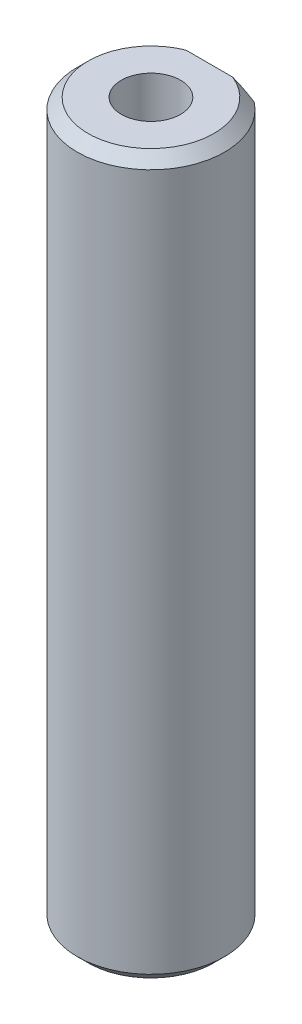
ISO-10303-21;
HEADER;
FILE_DESCRIPTION(('STEP AP214'),'2;1');
FILE_NAME('part.step','',(''),(''),'','','');
FILE_SCHEMA(('AUTOMOTIVE_DESIGN { 1 0 10303 214 1 1 1 1 }'));
ENDSEC;
DATA;
#1=APPLICATION_CONTEXT('core data for automotive mechanical design processes');
#2=APPLICATION_PROTOCOL_DEFINITION('international standard','automotive_design',2000,#1);
#3=PRODUCT_CONTEXT('',#1,'mechanical');
#4=PRODUCT('Part','Part','',(#3));
#5=PRODUCT_RELATED_PRODUCT_CATEGORY('part','',(#4));
#6=PRODUCT_DEFINITION_FORMATION('','',#4);
#7=PRODUCT_DEFINITION_CONTEXT('part definition',#1,'design');
#8=PRODUCT_DEFINITION('design','',#6,#7);
#9=PRODUCT_DEFINITION_SHAPE('','',#8);
#10=(LENGTH_UNIT() NAMED_UNIT(*) SI_UNIT(.MILLI.,.METRE.));
#11=(NAMED_UNIT(*) PLANE_ANGLE_UNIT() SI_UNIT($,.RADIAN.));
#12=(NAMED_UNIT(*) SI_UNIT($,.STERADIAN.) SOLID_ANGLE_UNIT());
#13=UNCERTAINTY_MEASURE_WITH_UNIT(LENGTH_MEASURE(1.E-05),#10,'distance_accuracy_value','');
#14=(GEOMETRIC_REPRESENTATION_CONTEXT(3) GLOBAL_UNCERTAINTY_ASSIGNED_CONTEXT((#13)) GLOBAL_UNIT_ASSIGNED_CONTEXT((#10,
#11,#12)) REPRESENTATION_CONTEXT('',''));
#15=CARTESIAN_POINT('',(0.,0.,0.));
#16=DIRECTION('',(0.,0.,1.));
#17=DIRECTION('',(1.,0.,0.));
#18=AXIS2_PLACEMENT_3D('',#15,#16,#17);
#19=CARTESIAN_POINT('',(0.,40.,-3.24961536185438));
#20=DIRECTION('',(0.,0.,-1.));
#21=DIRECTION('',(-1.,0.,0.));
#22=AXIS2_PLACEMENT_3D('',#19,#20,#21);
#23=PLANE('',#22);
#24=CARTESIAN_POINT('',(0.,20.,-3.24961536185438));
#25=DIRECTION('',(0.,0.,-1.));
#26=DIRECTION('',(-1.,0.,0.));
#27=AXIS2_PLACEMENT_3D('',#24,#25,#26);
#28=CIRCLE('',#27,1.75);
#29=CARTESIAN_POINT('',(-1.75,20.,-3.24961536185438));
#30=VERTEX_POINT('',#29);
#31=EDGE_CURVE('E105',#30,#30,#28,.T.);
#32=ORIENTED_EDGE('',*,*,#31,.F.);
#33=EDGE_LOOP('',(#32));
#34=FACE_BOUND('',#33,.T.);
#35=DIRECTION('',(0.,-1.,0.));
#36=VECTOR('',#35,1.);
#37=CARTESIAN_POINT('',(2.5,40.,-3.24961536185438));
#38=LINE('',#37,#36);
#39=CARTESIAN_POINT('',(2.5,39.4,-3.24961536185438));
#40=VERTEX_POINT('',#39);
#41=CARTESIAN_POINT('',(2.5,0.600000000000003,-3.24961536185438));
#42=VERTEX_POINT('',#41);
#43=EDGE_CURVE('E115',#40,#42,#38,.T.);
#44=ORIENTED_EDGE('',*,*,#43,.T.);
#45=CARTESIAN_POINT('',(2.5,0.600000000000003,-3.24961536185438));
#46=CARTESIAN_POINT('',(2.40432093025178,0.541691126129059,-3.24961536185438));
#47=CARTESIAN_POINT('',(2.30770860355266,0.484853971053794,-3.24961536185438));
#48=CARTESIAN_POINT('',(2.11257458402426,0.37510173604733,-3.24961536185438));
#49=CARTESIAN_POINT('',(2.01405769013835,0.322178097655985,-3.24961536185438));
#50=CARTESIAN_POINT('',(1.81458529619335,0.220931812528962,-3.24961536185438));
#51=CARTESIAN_POINT('',(1.71362843265534,0.172611816538498,-3.24961536185438));
#52=CARTESIAN_POINT('',(1.5089130315046,0.0816816493494726,-3.24961536185438));
#53=CARTESIAN_POINT('',(1.40514866298078,0.0390846665122068,-3.24961536185438));
#54=CARTESIAN_POINT('',(1.29999999999999,0.,-3.24961536185438));
#55=B_SPLINE_CURVE_WITH_KNOTS('',3,(#45,#46,#47,#48,#49,#50,#51,#52,#53,#54),.UNSPECIFIED.,.F.,
.F.,(4,2,2,2,4),(0.,0.336170169463952,0.671581981819804,1.00718576933356,1.34355013617968),.UNSPECIFIED.);
#56=CARTESIAN_POINT('',(1.29999999999999,0.,-3.24961536185438));
#57=VERTEX_POINT('',#56);
#58=EDGE_CURVE('E50',#42,#57,#55,.T.);
#59=ORIENTED_EDGE('',*,*,#58,.T.);
#60=DIRECTION('',(1.,0.,0.));
#61=VECTOR('',#60,1.);
#62=CARTESIAN_POINT('',(0.,0.,-3.24961536185438));
#63=LINE('',#62,#61);
#64=CARTESIAN_POINT('',(-1.29999999999999,0.,-3.24961536185438));
#65=VERTEX_POINT('',#64);
#66=EDGE_CURVE('E109',#65,#57,#63,.T.);
#67=ORIENTED_EDGE('',*,*,#66,.F.);
#68=CARTESIAN_POINT('',(-1.29999999999999,0.,-3.24961536185438));
#69=CARTESIAN_POINT('',(-1.40514866298078,0.0390846665122067,-3.24961536185438));
#70=CARTESIAN_POINT('',(-1.5089130315046,0.0816816493494726,-3.24961536185438));
#71=CARTESIAN_POINT('',(-1.71362843265534,0.172611816538498,-3.24961536185438));
#72=CARTESIAN_POINT('',(-1.81458529619335,0.220931812528963,-3.24961536185438));
#73=CARTESIAN_POINT('',(-2.01405769013835,0.322178097655985,-3.24961536185438));
#74=CARTESIAN_POINT('',(-2.11257458402426,0.37510173604733,-3.24961536185438));
#75=CARTESIAN_POINT('',(-2.30770860355265,0.484853971053794,-3.24961536185438));
#76=CARTESIAN_POINT('',(-2.40432093025178,0.541691126129059,-3.24961536185438));
#77=CARTESIAN_POINT('',(-2.5,0.600000000000003,-3.24961536185438));
#78=B_SPLINE_CURVE_WITH_KNOTS('',3,(#68,#69,#70,#71,#72,#73,#74,#75,#76,#77),.UNSPECIFIED.,.F.,
.F.,(4,2,2,2,4),(0.,0.336364366846117,0.671968154359877,1.00737996671573,1.34355013617968),.UNSPECIFIED.);
#79=CARTESIAN_POINT('',(-2.5,0.600000000000003,-3.24961536185438));
#80=VERTEX_POINT('',#79);
#81=EDGE_CURVE('E171',#65,#80,#78,.T.);
#82=ORIENTED_EDGE('',*,*,#81,.T.);
#83=DIRECTION('',(0.,-1.,0.));
#84=VECTOR('',#83,1.);
#85=CARTESIAN_POINT('',(-2.5,40.,-3.24961536185438));
#86=LINE('',#85,#84);
#87=CARTESIAN_POINT('',(-2.5,39.4,-3.24961536185438));
#88=VERTEX_POINT('',#87);
#89=EDGE_CURVE('E118',#88,#80,#86,.T.);
#90=ORIENTED_EDGE('',*,*,#89,.F.);
#91=CARTESIAN_POINT('',(-2.5,39.4,-3.24961536185438));
#92=CARTESIAN_POINT('',(-2.40432093025178,39.4583088738709,-3.24961536185438));
#93=CARTESIAN_POINT('',(-2.30770860355265,39.5151460289462,-3.24961536185438));
#94=CARTESIAN_POINT('',(-2.11257458402426,39.6248982639527,-3.24961536185438));
#95=CARTESIAN_POINT('',(-2.01405769013834,39.677821902344,-3.24961536185438));
#96=CARTESIAN_POINT('',(-1.81458529619335,39.779068187471,-3.24961536185438));
#97=CARTESIAN_POINT('',(-1.71362843265533,39.8273881834615,-3.24961536185438));
#98=CARTESIAN_POINT('',(-1.50891303150459,39.9183183506505,-3.24961536185438));
#99=CARTESIAN_POINT('',(-1.40514866298077,39.9609153334878,-3.24961536185438));
#100=CARTESIAN_POINT('',(-1.29999999999998,40.,-3.24961536185438));
#101=B_SPLINE_CURVE_WITH_KNOTS('',3,(#91,#92,#93,#94,#95,#96,#97,#98,#99,#100),.UNSPECIFIED.,
.F.,.F.,(4,2,2,2,4),(0.,0.336170169463955,0.671581981819809,1.00718576933357,1.34355013617969),.UNSPECIFIED.);
#102=CARTESIAN_POINT('',(-1.29999999999998,40.,-3.24961536185438));
#103=VERTEX_POINT('',#102);
#104=EDGE_CURVE('E124',#88,#103,#101,.T.);
#105=ORIENTED_EDGE('',*,*,#104,.T.);
#106=DIRECTION('',(1.,0.,0.));
#107=VECTOR('',#106,1.);
#108=CARTESIAN_POINT('',(0.,40.,-3.24961536185438));
#109=LINE('',#108,#107);
#110=CARTESIAN_POINT('',(1.29999999999998,40.,-3.24961536185438));
#111=VERTEX_POINT('',#110);
#112=EDGE_CURVE('E112',#103,#111,#109,.T.);
#113=ORIENTED_EDGE('',*,*,#112,.T.);
#114=CARTESIAN_POINT('',(1.29999999999998,40.,-3.24961536185438));
#115=CARTESIAN_POINT('',(1.40514866298077,39.9609153334878,-3.24961536185438));
#116=CARTESIAN_POINT('',(1.50891303150459,39.9183183506505,-3.24961536185438));
#117=CARTESIAN_POINT('',(1.71362843265533,39.8273881834615,-3.24961536185438));
#118=CARTESIAN_POINT('',(1.81458529619335,39.779068187471,-3.24961536185438));
#119=CARTESIAN_POINT('',(2.01405769013835,39.677821902344,-3.24961536185438));
#120=CARTESIAN_POINT('',(2.11257458402426,39.6248982639527,-3.24961536185438));
#121=CARTESIAN_POINT('',(2.30770860355266,39.5151460289462,-3.24961536185438));
#122=CARTESIAN_POINT('',(2.40432093025178,39.4583088738709,-3.24961536185438));
#123=CARTESIAN_POINT('',(2.5,39.4,-3.24961536185438));
#124=B_SPLINE_CURVE_WITH_KNOTS('',3,(#114,#115,#116,#117,#118,#119,#120,#121,#122,#123),
.UNSPECIFIED.,.F.,.F.,(4,2,2,2,4),(0.,0.336364366846119,0.671968154359884,1.00737996671574,
1.34355013617969),.UNSPECIFIED.);
#125=EDGE_CURVE('E131',#111,#40,#124,.T.);
#126=ORIENTED_EDGE('',*,*,#125,.T.);
#127=EDGE_LOOP('',(#44,#59,#67,#82,#90,#105,#113,#126));
#128=FACE_BOUND('',#127,.T.);
#129=ADVANCED_FACE('F40',(#34,#128),#23,.T.);
#130=CARTESIAN_POINT('',(0.,40.,0.));
#131=DIRECTION('',(0.,-1.,0.));
#132=DIRECTION('',(0.,0.,-1.));
#133=AXIS2_PLACEMENT_3D('',#130,#131,#132);
#134=CYLINDRICAL_SURFACE('',#133,4.1);
#135=ORIENTED_EDGE('',*,*,#89,.T.);
#136=CARTESIAN_POINT('',(0.,0.600000000000003,0.));
#137=DIRECTION('',(0.,1.,0.));
#138=DIRECTION('',(0.,0.,1.));
#139=AXIS2_PLACEMENT_3D('',#136,#137,#138);
#140=CIRCLE('',#139,4.1);
#141=EDGE_CURVE('E169',#80,#42,#140,.T.);
#142=ORIENTED_EDGE('',*,*,#141,.T.);
#143=ORIENTED_EDGE('',*,*,#43,.F.);
#144=CARTESIAN_POINT('',(0.,39.4,0.));
#145=DIRECTION('',(0.,1.,0.));
#146=DIRECTION('',(0.,0.,1.));
#147=AXIS2_PLACEMENT_3D('',#144,#145,#146);
#148=CIRCLE('',#147,4.1);
#149=EDGE_CURVE('E166',#40,#88,#148,.F.);
#150=ORIENTED_EDGE('',*,*,#149,.T.);
#151=EDGE_LOOP('',(#135,#142,#143,#150));
#152=FACE_BOUND('',#151,.T.);
#153=ADVANCED_FACE('F155',(#152),#134,.T.);
#154=CARTESIAN_POINT('',(0.,40.,0.));
#155=DIRECTION('',(0.,1.,0.));
#156=DIRECTION('',(0.,0.,1.));
#157=AXIS2_PLACEMENT_3D('',#154,#155,#156);
#158=PLANE('',#157);
#159=CARTESIAN_POINT('',(0.,40.,0.));
#160=DIRECTION('',(0.,1.,0.));
#161=DIRECTION('',(0.,0.,1.));
#162=AXIS2_PLACEMENT_3D('',#159,#160,#161);
#163=CIRCLE('',#162,1.65);
#164=CARTESIAN_POINT('',(0.,40.,1.65));
#165=VERTEX_POINT('',#164);
#166=EDGE_CURVE('E94',#165,#165,#163,.T.);
#167=ORIENTED_EDGE('',*,*,#166,.F.);
#168=EDGE_LOOP('',(#167));
#169=FACE_BOUND('',#168,.T.);
#170=ORIENTED_EDGE('',*,*,#112,.F.);
#171=CARTESIAN_POINT('',(0.,40.,0.));
#172=DIRECTION('',(0.,1.,0.));
#173=DIRECTION('',(0.,0.,1.));
#174=AXIS2_PLACEMENT_3D('',#171,#172,#173);
#175=CIRCLE('',#174,3.49999999999999);
#176=EDGE_CURVE('E121',#103,#111,#175,.T.);
#177=ORIENTED_EDGE('',*,*,#176,.T.);
#178=EDGE_LOOP('',(#170,#177));
#179=FACE_BOUND('',#178,.T.);
#180=ADVANCED_FACE('F160',(#169,#179),#158,.T.);
#181=CARTESIAN_POINT('',(0.,0.,0.));
#182=DIRECTION('',(0.,1.,0.));
#183=DIRECTION('',(0.,0.,1.));
#184=AXIS2_PLACEMENT_3D('',#181,#182,#183);
#185=PLANE('',#184);
#186=CARTESIAN_POINT('',(0.,0.,0.));
#187=DIRECTION('',(0.,-1.,0.));
#188=DIRECTION('',(0.,0.,-1.));
#189=AXIS2_PLACEMENT_3D('',#186,#187,#188);
#190=CIRCLE('',#189,1.65);
#191=CARTESIAN_POINT('',(0.,0.,-1.65));
#192=VERTEX_POINT('',#191);
#193=EDGE_CURVE('E95',#192,#192,#190,.T.);
#194=ORIENTED_EDGE('',*,*,#193,.F.);
#195=EDGE_LOOP('',(#194));
#196=FACE_BOUND('',#195,.T.);
#197=ORIENTED_EDGE('',*,*,#66,.T.);
#198=CARTESIAN_POINT('',(0.,0.,0.));
#199=DIRECTION('',(0.,1.,0.));
#200=DIRECTION('',(0.,0.,1.));
#201=AXIS2_PLACEMENT_3D('',#198,#199,#200);
#202=CIRCLE('',#201,3.5);
#203=EDGE_CURVE('E11',#57,#65,#202,.F.);
#204=ORIENTED_EDGE('',*,*,#203,.T.);
#205=EDGE_LOOP('',(#197,#204));
#206=FACE_BOUND('',#205,.T.);
#207=ADVANCED_FACE('F183',(#196,#206),#185,.F.);
#208=CARTESIAN_POINT('',(0.,20.,0.750384638145617));
#209=DIRECTION('',(0.,0.,-1.));
#210=DIRECTION('',(-1.,0.,0.));
#211=AXIS2_PLACEMENT_3D('',#208,#209,#210);
#212=CYLINDRICAL_SURFACE('',#211,1.75);
#213=CARTESIAN_POINT('',(0.,20.,0.750384638145617));
#214=DIRECTION('',(0.,0.,-1.));
#215=DIRECTION('',(-1.,0.,0.));
#216=AXIS2_PLACEMENT_3D('',#213,#214,#215);
#217=CIRCLE('',#216,1.75);
#218=CARTESIAN_POINT('',(-1.75,20.,0.750384638145617));
#219=VERTEX_POINT('',#218);
#220=EDGE_CURVE('E106',#219,#219,#217,.T.);
#221=ORIENTED_EDGE('',*,*,#220,.F.);
#222=EDGE_LOOP('',(#221));
#223=FACE_BOUND('',#222,.T.);
#224=ORIENTED_EDGE('',*,*,#31,.T.);
#225=EDGE_LOOP('',(#224));
#226=FACE_BOUND('',#225,.T.);
#227=ADVANCED_FACE('F185',(#223,#226),#212,.F.);
#228=CARTESIAN_POINT('',(0.,20.,0.750384638145617));
#229=DIRECTION('',(0.,0.,-1.));
#230=DIRECTION('',(-1.,0.,0.));
#231=AXIS2_PLACEMENT_3D('',#228,#229,#230);
#232=PLANE('',#231);
#233=ORIENTED_EDGE('',*,*,#220,.T.);
#234=EDGE_LOOP('',(#233));
#235=FACE_BOUND('',#234,.T.);
#236=ADVANCED_FACE('F192',(#235),#232,.T.);
#237=CARTESIAN_POINT('',(0.,25.9914200213955,0.));
#238=DIRECTION('',(0.,1.,0.));
#239=DIRECTION('',(0.,0.,1.));
#240=AXIS2_PLACEMENT_3D('',#237,#238,#239);
#241=CONICAL_SURFACE('',#240,1.65,1.02974425867665);
#242=CARTESIAN_POINT('',(0.,25.,0.));
#243=VERTEX_POINT('',#242);
#244=VERTEX_LOOP('',#243);
#245=FACE_BOUND('',#244,.T.);
#246=CARTESIAN_POINT('',(0.,25.9914200213955,0.));
#247=DIRECTION('',(0.,1.,0.));
#248=DIRECTION('',(0.,0.,1.));
#249=AXIS2_PLACEMENT_3D('',#246,#247,#248);
#250=CIRCLE('',#249,1.65);
#251=CARTESIAN_POINT('',(0.,25.9914200213955,1.65));
#252=VERTEX_POINT('',#251);
#253=EDGE_CURVE('E98',#252,#252,#250,.T.);
#254=ORIENTED_EDGE('',*,*,#253,.T.);
#255=EDGE_LOOP('',(#254));
#256=FACE_BOUND('',#255,.T.);
#257=ADVANCED_FACE('F201',(#245,#256),#241,.F.);
#258=CARTESIAN_POINT('',(0.,40.,0.));
#259=DIRECTION('',(0.,1.,0.));
#260=DIRECTION('',(0.,0.,1.));
#261=AXIS2_PLACEMENT_3D('',#258,#259,#260);
#262=CYLINDRICAL_SURFACE('',#261,1.65);
#263=ORIENTED_EDGE('',*,*,#253,.F.);
#264=EDGE_LOOP('',(#263));
#265=FACE_BOUND('',#264,.T.);
#266=ORIENTED_EDGE('',*,*,#166,.T.);
#267=EDGE_LOOP('',(#266));
#268=FACE_BOUND('',#267,.T.);
#269=ADVANCED_FACE('F88',(#265,#268),#262,.F.);
#270=CARTESIAN_POINT('',(0.,14.0085799786045,0.));
#271=DIRECTION('',(0.,-1.,0.));
#272=DIRECTION('',(0.,0.,-1.));
#273=AXIS2_PLACEMENT_3D('',#270,#271,#272);
#274=CONICAL_SURFACE('',#273,1.65,1.02974425867665);
#275=CARTESIAN_POINT('',(0.,15.,0.));
#276=VERTEX_POINT('',#275);
#277=VERTEX_LOOP('',#276);
#278=FACE_BOUND('',#277,.T.);
#279=CARTESIAN_POINT('',(0.,14.0085799786045,0.));
#280=DIRECTION('',(0.,-1.,0.));
#281=DIRECTION('',(0.,0.,-1.));
#282=AXIS2_PLACEMENT_3D('',#279,#280,#281);
#283=CIRCLE('',#282,1.65);
#284=CARTESIAN_POINT('',(0.,14.0085799786045,-1.65));
#285=VERTEX_POINT('',#284);
#286=EDGE_CURVE('E92',#285,#285,#283,.T.);
#287=ORIENTED_EDGE('',*,*,#286,.T.);
#288=EDGE_LOOP('',(#287));
#289=FACE_BOUND('',#288,.T.);
#290=ADVANCED_FACE('F84',(#278,#289),#274,.F.);
#291=CARTESIAN_POINT('',(0.,0.,0.));
#292=DIRECTION('',(0.,-1.,0.));
#293=DIRECTION('',(0.,0.,-1.));
#294=AXIS2_PLACEMENT_3D('',#291,#292,#293);
#295=CYLINDRICAL_SURFACE('',#294,1.65);
#296=ORIENTED_EDGE('',*,*,#286,.F.);
#297=EDGE_LOOP('',(#296));
#298=FACE_BOUND('',#297,.T.);
#299=ORIENTED_EDGE('',*,*,#193,.T.);
#300=EDGE_LOOP('',(#299));
#301=FACE_BOUND('',#300,.T.);
#302=ADVANCED_FACE('F87',(#298,#301),#295,.F.);
#303=CARTESIAN_POINT('',(0.,40.,0.));
#304=DIRECTION('',(0.,-1.,0.));
#305=DIRECTION('',(0.,0.,-1.));
#306=AXIS2_PLACEMENT_3D('',#303,#304,#305);
#307=CONICAL_SURFACE('',#306,3.49999999999999,0.785398163397451);
#308=ORIENTED_EDGE('',*,*,#104,.F.);
#309=ORIENTED_EDGE('',*,*,#149,.F.);
#310=ORIENTED_EDGE('',*,*,#125,.F.);
#311=ORIENTED_EDGE('',*,*,#176,.F.);
#312=EDGE_LOOP('',(#308,#309,#310,#311));
#313=FACE_BOUND('',#312,.T.);
#314=ADVANCED_FACE('F140',(#313),#307,.T.);
#315=CARTESIAN_POINT('',(0.,0.600000000000003,0.));
#316=DIRECTION('',(0.,1.,0.));
#317=DIRECTION('',(0.,0.,1.));
#318=AXIS2_PLACEMENT_3D('',#315,#316,#317);
#319=CONICAL_SURFACE('',#318,4.1,0.785398163397448);
#320=ORIENTED_EDGE('',*,*,#81,.F.);
#321=ORIENTED_EDGE('',*,*,#203,.F.);
#322=ORIENTED_EDGE('',*,*,#58,.F.);
#323=ORIENTED_EDGE('',*,*,#141,.F.);
#324=EDGE_LOOP('',(#320,#321,#322,#323));
#325=FACE_BOUND('',#324,.T.);
#326=ADVANCED_FACE('F43',(#325),#319,.T.);
#327=CLOSED_SHELL('',(#129,#153,#180,#207,#227,#236,#257,#269,#290,#302,#314,#326));
#328=MANIFOLD_SOLID_BREP('B2',#327);
#329=ADVANCED_BREP_SHAPE_REPRESENTATION('',(#18,#328),#14);
#330=SHAPE_DEFINITION_REPRESENTATION(#9,#329);
ENDSEC;
END-ISO-10303-21;
